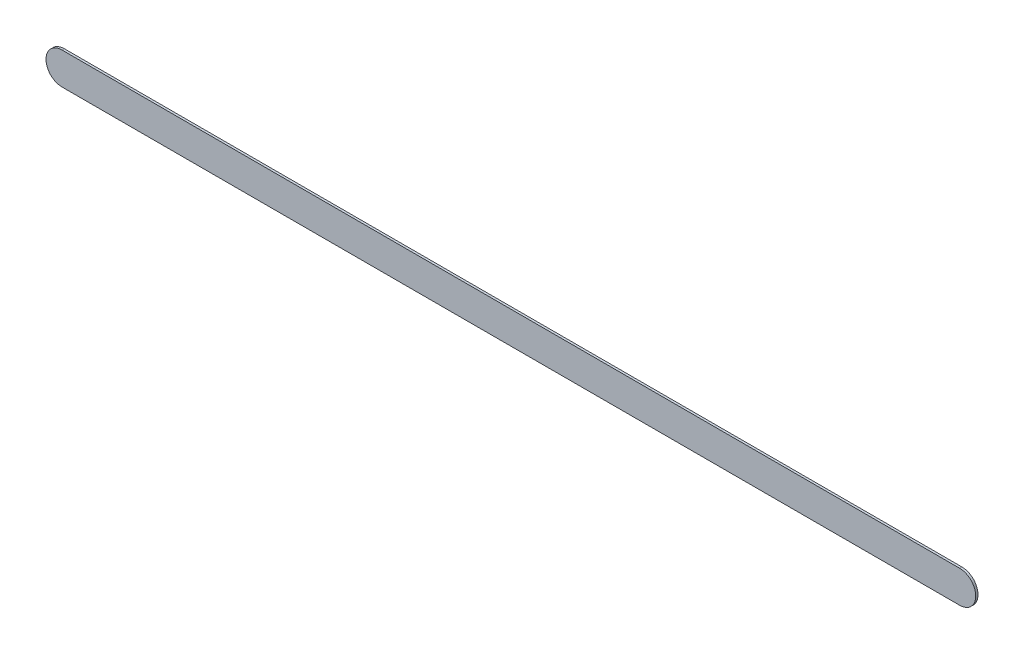
ISO-10303-21;
HEADER;
FILE_DESCRIPTION(('STEP AP214'),'2;1');
FILE_NAME('part.step','',(''),(''),'','','');
FILE_SCHEMA(('AUTOMOTIVE_DESIGN { 1 0 10303 214 1 1 1 1 }'));
ENDSEC;
DATA;
#1=APPLICATION_CONTEXT('core data for automotive mechanical design processes');
#2=APPLICATION_PROTOCOL_DEFINITION('international standard','automotive_design',2000,#1);
#3=PRODUCT_CONTEXT('',#1,'mechanical');
#4=PRODUCT('Part','Part','',(#3));
#5=PRODUCT_RELATED_PRODUCT_CATEGORY('part','',(#4));
#6=PRODUCT_DEFINITION_FORMATION('','',#4);
#7=PRODUCT_DEFINITION_CONTEXT('part definition',#1,'design');
#8=PRODUCT_DEFINITION('design','',#6,#7);
#9=PRODUCT_DEFINITION_SHAPE('','',#8);
#10=(LENGTH_UNIT() NAMED_UNIT(*) SI_UNIT(.MILLI.,.METRE.));
#11=(NAMED_UNIT(*) PLANE_ANGLE_UNIT() SI_UNIT($,.RADIAN.));
#12=(NAMED_UNIT(*) SI_UNIT($,.STERADIAN.) SOLID_ANGLE_UNIT());
#13=UNCERTAINTY_MEASURE_WITH_UNIT(LENGTH_MEASURE(1.E-05),#10,'distance_accuracy_value','');
#14=(GEOMETRIC_REPRESENTATION_CONTEXT(3) GLOBAL_UNCERTAINTY_ASSIGNED_CONTEXT((#13)) GLOBAL_UNIT_ASSIGNED_CONTEXT((#10,
#11,#12)) REPRESENTATION_CONTEXT('',''));
#15=CARTESIAN_POINT('',(0.,0.,0.));
#16=DIRECTION('',(0.,0.,1.));
#17=DIRECTION('',(1.,0.,0.));
#18=AXIS2_PLACEMENT_3D('',#15,#16,#17);
#19=CARTESIAN_POINT('',(37.9000004,81.7500016,0.));
#20=DIRECTION('',(0.,1.,0.));
#21=DIRECTION('',(1.,0.,0.));
#22=AXIS2_PLACEMENT_3D('',#19,#20,#21);
#23=PLANE('',#22);
#24=DIRECTION('',(1.,0.,0.));
#25=VECTOR('',#24,1.);
#26=CARTESIAN_POINT('',(37.9000004,81.7500016,0.03556));
#27=LINE('',#26,#25);
#28=CARTESIAN_POINT('',(37.9000004,81.7500016,0.03556));
#29=VERTEX_POINT('',#28);
#30=CARTESIAN_POINT('',(51.90000034,81.7500016,0.03556));
#31=VERTEX_POINT('',#30);
#32=EDGE_CURVE('E11',#29,#31,#27,.T.);
#33=ORIENTED_EDGE('',*,*,#32,.F.);
#34=DIRECTION('',(0.,0.,1.));
#35=VECTOR('',#34,1.);
#36=CARTESIAN_POINT('',(37.9000004,81.7500016,0.));
#37=LINE('',#36,#35);
#38=CARTESIAN_POINT('',(37.9000004,81.7500016,0.));
#39=VERTEX_POINT('',#38);
#40=EDGE_CURVE('E24',#39,#29,#37,.T.);
#41=ORIENTED_EDGE('',*,*,#40,.F.);
#42=DIRECTION('',(1.,0.,0.));
#43=VECTOR('',#42,1.);
#44=CARTESIAN_POINT('',(37.9000004,81.7500016,0.));
#45=LINE('',#44,#43);
#46=CARTESIAN_POINT('',(51.90000034,81.7500016,0.));
#47=VERTEX_POINT('',#46);
#48=EDGE_CURVE('E75',#39,#47,#45,.T.);
#49=ORIENTED_EDGE('',*,*,#48,.T.);
#50=DIRECTION('',(0.,0.,1.));
#51=VECTOR('',#50,1.);
#52=CARTESIAN_POINT('',(51.90000034,81.7500016,0.));
#53=LINE('',#52,#51);
#54=EDGE_CURVE('E37',#47,#31,#53,.T.);
#55=ORIENTED_EDGE('',*,*,#54,.T.);
#56=EDGE_LOOP('',(#33,#41,#49,#55));
#57=FACE_BOUND('',#56,.T.);
#58=ADVANCED_FACE('F17',(#57),#23,.F.);
#59=CARTESIAN_POINT('',(51.90000034,82.0000011,0.));
#60=DIRECTION('',(0.,0.,-1.));
#61=DIRECTION('',(0.,-1.,0.));
#62=AXIS2_PLACEMENT_3D('',#59,#60,#61);
#63=CYLINDRICAL_SURFACE('',#62,0.249999500000001);
#64=CARTESIAN_POINT('',(51.90000034,82.0000011,0.03556));
#65=DIRECTION('',(0.,0.,1.));
#66=DIRECTION('',(0.,-1.,0.));
#67=AXIS2_PLACEMENT_3D('',#64,#65,#66);
#68=CIRCLE('',#67,0.249999500000001);
#69=CARTESIAN_POINT('',(51.90000034,82.2500006,0.03556));
#70=VERTEX_POINT('',#69);
#71=EDGE_CURVE('E83',#31,#70,#68,.T.);
#72=ORIENTED_EDGE('',*,*,#71,.F.);
#73=ORIENTED_EDGE('',*,*,#54,.F.);
#74=CARTESIAN_POINT('',(51.90000034,82.0000011,0.));
#75=DIRECTION('',(0.,0.,1.));
#76=DIRECTION('',(0.,-1.,0.));
#77=AXIS2_PLACEMENT_3D('',#74,#75,#76);
#78=CIRCLE('',#77,0.249999500000001);
#79=CARTESIAN_POINT('',(51.90000034,82.2500006,0.));
#80=VERTEX_POINT('',#79);
#81=EDGE_CURVE('E81',#47,#80,#78,.T.);
#82=ORIENTED_EDGE('',*,*,#81,.T.);
#83=DIRECTION('',(0.,0.,1.));
#84=VECTOR('',#83,1.);
#85=CARTESIAN_POINT('',(51.90000034,82.2500006,0.));
#86=LINE('',#85,#84);
#87=EDGE_CURVE('E67',#80,#70,#86,.T.);
#88=ORIENTED_EDGE('',*,*,#87,.T.);
#89=EDGE_LOOP('',(#72,#73,#82,#88));
#90=FACE_BOUND('',#89,.T.);
#91=ADVANCED_FACE('F89',(#90),#63,.T.);
#92=CARTESIAN_POINT('',(51.90000034,82.2500006,0.));
#93=DIRECTION('',(0.,-1.,0.));
#94=DIRECTION('',(-1.,0.,0.));
#95=AXIS2_PLACEMENT_3D('',#92,#93,#94);
#96=PLANE('',#95);
#97=DIRECTION('',(-1.,0.,0.));
#98=VECTOR('',#97,1.);
#99=CARTESIAN_POINT('',(51.90000034,82.2500006,0.03556));
#100=LINE('',#99,#98);
#101=CARTESIAN_POINT('',(37.9000004,82.2500006,0.03556));
#102=VERTEX_POINT('',#101);
#103=EDGE_CURVE('E71',#70,#102,#100,.T.);
#104=ORIENTED_EDGE('',*,*,#103,.F.);
#105=ORIENTED_EDGE('',*,*,#87,.F.);
#106=DIRECTION('',(-1.,0.,0.));
#107=VECTOR('',#106,1.);
#108=CARTESIAN_POINT('',(51.90000034,82.2500006,0.));
#109=LINE('',#108,#107);
#110=CARTESIAN_POINT('',(37.9000004,82.2500006,0.));
#111=VERTEX_POINT('',#110);
#112=EDGE_CURVE('E63',#80,#111,#109,.T.);
#113=ORIENTED_EDGE('',*,*,#112,.T.);
#114=DIRECTION('',(0.,0.,1.));
#115=VECTOR('',#114,1.);
#116=CARTESIAN_POINT('',(37.9000004,82.2500006,0.));
#117=LINE('',#116,#115);
#118=EDGE_CURVE('E53',#111,#102,#117,.T.);
#119=ORIENTED_EDGE('',*,*,#118,.T.);
#120=EDGE_LOOP('',(#104,#105,#113,#119));
#121=FACE_BOUND('',#120,.T.);
#122=ADVANCED_FACE('F66',(#121),#96,.F.);
#123=CARTESIAN_POINT('',(37.9000004,82.0000011,0.));
#124=DIRECTION('',(0.,0.,-1.));
#125=DIRECTION('',(0.,1.,0.));
#126=AXIS2_PLACEMENT_3D('',#123,#124,#125);
#127=CYLINDRICAL_SURFACE('',#126,0.249999500000001);
#128=CARTESIAN_POINT('',(37.9000004,82.0000011,0.03556));
#129=DIRECTION('',(0.,0.,1.));
#130=DIRECTION('',(0.,1.,0.));
#131=AXIS2_PLACEMENT_3D('',#128,#129,#130);
#132=CIRCLE('',#131,0.249999500000001);
#133=EDGE_CURVE('E59',#102,#29,#132,.T.);
#134=ORIENTED_EDGE('',*,*,#133,.F.);
#135=ORIENTED_EDGE('',*,*,#118,.F.);
#136=CARTESIAN_POINT('',(37.9000004,82.0000011,0.));
#137=DIRECTION('',(0.,0.,1.));
#138=DIRECTION('',(0.,1.,0.));
#139=AXIS2_PLACEMENT_3D('',#136,#137,#138);
#140=CIRCLE('',#139,0.249999500000001);
#141=EDGE_CURVE('E57',#111,#39,#140,.T.);
#142=ORIENTED_EDGE('',*,*,#141,.T.);
#143=ORIENTED_EDGE('',*,*,#40,.T.);
#144=EDGE_LOOP('',(#134,#135,#142,#143));
#145=FACE_BOUND('',#144,.T.);
#146=ADVANCED_FACE('F55',(#145),#127,.T.);
#147=CARTESIAN_POINT('',(37.9000004,81.7500016,0.));
#148=DIRECTION('',(0.,0.,-1.));
#149=DIRECTION('',(-1.,0.,0.));
#150=AXIS2_PLACEMENT_3D('',#147,#148,#149);
#151=PLANE('',#150);
#152=ORIENTED_EDGE('',*,*,#141,.F.);
#153=ORIENTED_EDGE('',*,*,#112,.F.);
#154=ORIENTED_EDGE('',*,*,#81,.F.);
#155=ORIENTED_EDGE('',*,*,#48,.F.);
#156=EDGE_LOOP('',(#152,#153,#154,#155));
#157=FACE_BOUND('',#156,.T.);
#158=ADVANCED_FACE('F74',(#157),#151,.T.);
#159=CARTESIAN_POINT('',(37.9000004,81.7500016,0.03556));
#160=DIRECTION('',(0.,0.,-1.));
#161=DIRECTION('',(-1.,0.,0.));
#162=AXIS2_PLACEMENT_3D('',#159,#160,#161);
#163=PLANE('',#162);
#164=ORIENTED_EDGE('',*,*,#32,.T.);
#165=ORIENTED_EDGE('',*,*,#71,.T.);
#166=ORIENTED_EDGE('',*,*,#103,.T.);
#167=ORIENTED_EDGE('',*,*,#133,.T.);
#168=EDGE_LOOP('',(#164,#165,#166,#167));
#169=FACE_BOUND('',#168,.T.);
#170=ADVANCED_FACE('F91',(#169),#163,.F.);
#171=CLOSED_SHELL('',(#58,#91,#122,#146,#158,#170));
#172=MANIFOLD_SOLID_BREP('B1',#171);
#173=ADVANCED_BREP_SHAPE_REPRESENTATION('',(#18,#172),#14);
#174=SHAPE_DEFINITION_REPRESENTATION(#9,#173);
ENDSEC;
END-ISO-10303-21;
